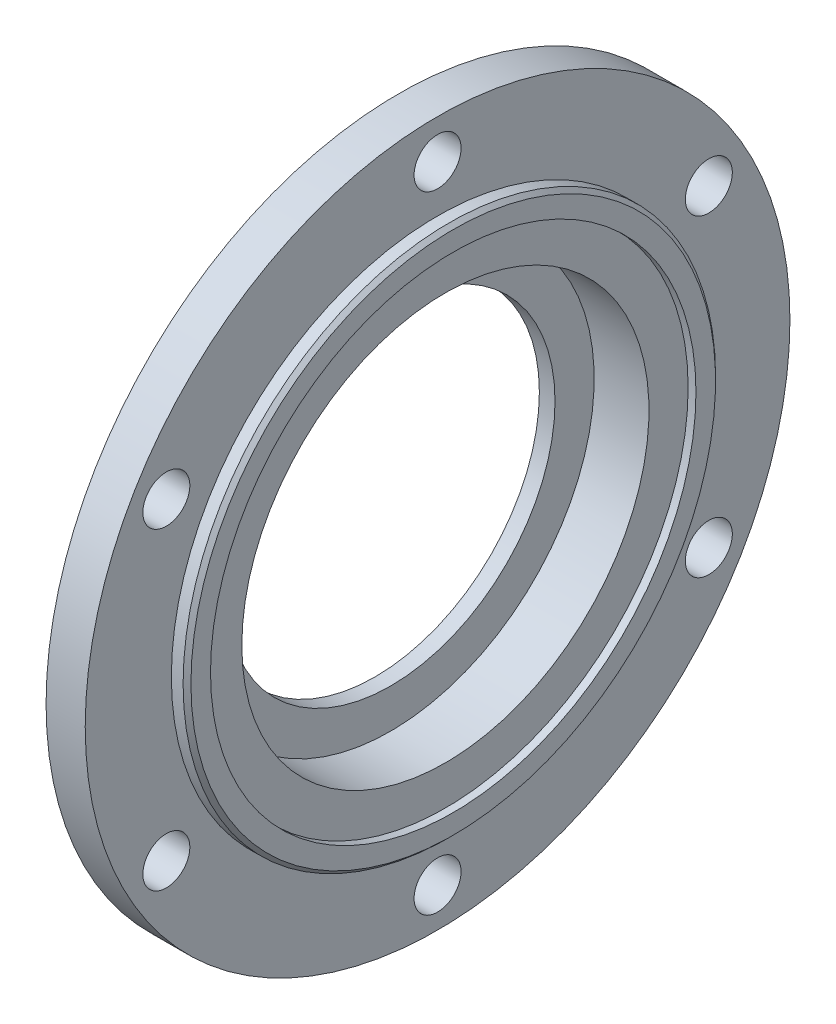
ISO-10303-21;
HEADER;
FILE_DESCRIPTION(('STEP AP214'),'2;1');
FILE_NAME('part.step','',(''),(''),'','','');
FILE_SCHEMA(('AUTOMOTIVE_DESIGN { 1 0 10303 214 1 1 1 1 }'));
ENDSEC;
DATA;
#1=APPLICATION_CONTEXT('core data for automotive mechanical design processes');
#2=APPLICATION_PROTOCOL_DEFINITION('international standard','automotive_design',2000,#1);
#3=PRODUCT_CONTEXT('',#1,'mechanical');
#4=PRODUCT('Part','Part','',(#3));
#5=PRODUCT_RELATED_PRODUCT_CATEGORY('part','',(#4));
#6=PRODUCT_DEFINITION_FORMATION('','',#4);
#7=PRODUCT_DEFINITION_CONTEXT('part definition',#1,'design');
#8=PRODUCT_DEFINITION('design','',#6,#7);
#9=PRODUCT_DEFINITION_SHAPE('','',#8);
#10=(LENGTH_UNIT() NAMED_UNIT(*) SI_UNIT(.MILLI.,.METRE.));
#11=(NAMED_UNIT(*) PLANE_ANGLE_UNIT() SI_UNIT($,.RADIAN.));
#12=(NAMED_UNIT(*) SI_UNIT($,.STERADIAN.) SOLID_ANGLE_UNIT());
#13=UNCERTAINTY_MEASURE_WITH_UNIT(LENGTH_MEASURE(1.E-05),#10,'distance_accuracy_value','');
#14=(GEOMETRIC_REPRESENTATION_CONTEXT(3) GLOBAL_UNCERTAINTY_ASSIGNED_CONTEXT((#13)) GLOBAL_UNIT_ASSIGNED_CONTEXT((#10,
#11,#12)) REPRESENTATION_CONTEXT('',''));
#15=CARTESIAN_POINT('',(0.,0.,0.));
#16=DIRECTION('',(0.,0.,1.));
#17=DIRECTION('',(1.,0.,0.));
#18=AXIS2_PLACEMENT_3D('',#15,#16,#17);
#19=CARTESIAN_POINT('',(0.,0.,0.));
#20=DIRECTION('',(-1.,0.,0.));
#21=DIRECTION('',(0.,0.,1.));
#22=AXIS2_PLACEMENT_3D('',#19,#20,#21);
#23=CYLINDRICAL_SURFACE('',#22,21.);
#24=CARTESIAN_POINT('',(2.,0.,0.));
#25=DIRECTION('',(-1.,0.,0.));
#26=DIRECTION('',(0.,0.,1.));
#27=AXIS2_PLACEMENT_3D('',#24,#25,#26);
#28=CIRCLE('',#27,21.);
#29=CARTESIAN_POINT('',(2.,0.,21.));
#30=VERTEX_POINT('',#29);
#31=EDGE_CURVE('E78',#30,#30,#28,.T.);
#32=ORIENTED_EDGE('',*,*,#31,.F.);
#33=EDGE_LOOP('',(#32));
#34=FACE_BOUND('',#33,.T.);
#35=CARTESIAN_POINT('',(0.,0.,0.));
#36=DIRECTION('',(-1.,0.,0.));
#37=DIRECTION('',(0.,0.,1.));
#38=AXIS2_PLACEMENT_3D('',#35,#36,#37);
#39=CIRCLE('',#38,21.);
#40=CARTESIAN_POINT('',(0.,0.,21.));
#41=VERTEX_POINT('',#40);
#42=EDGE_CURVE('E10',#41,#41,#39,.T.);
#43=ORIENTED_EDGE('',*,*,#42,.T.);
#44=EDGE_LOOP('',(#43));
#45=FACE_BOUND('',#44,.T.);
#46=ADVANCED_FACE('F37',(#34,#45),#23,.F.);
#47=CARTESIAN_POINT('',(0.,0.,-21.));
#48=DIRECTION('',(1.,0.,0.));
#49=DIRECTION('',(0.,0.,-1.));
#50=AXIS2_PLACEMENT_3D('',#47,#48,#49);
#51=PLANE('',#50);
#52=ORIENTED_EDGE('',*,*,#42,.F.);
#53=EDGE_LOOP('',(#52));
#54=FACE_BOUND('',#53,.T.);
#55=CARTESIAN_POINT('',(0.,0.,0.));
#56=DIRECTION('',(-1.,0.,0.));
#57=DIRECTION('',(0.,0.,1.));
#58=AXIS2_PLACEMENT_3D('',#55,#56,#57);
#59=CIRCLE('',#58,31.);
#60=CARTESIAN_POINT('',(0.,0.,31.));
#61=VERTEX_POINT('',#60);
#62=EDGE_CURVE('E45',#61,#61,#59,.T.);
#63=ORIENTED_EDGE('',*,*,#62,.T.);
#64=EDGE_LOOP('',(#63));
#65=FACE_BOUND('',#64,.T.);
#66=ADVANCED_FACE('F198',(#54,#65),#51,.F.);
#67=CARTESIAN_POINT('',(3.,0.,0.));
#68=DIRECTION('',(1.,0.,0.));
#69=DIRECTION('',(0.,0.,-1.));
#70=AXIS2_PLACEMENT_3D('',#67,#68,#69);
#71=CONICAL_SURFACE('',#70,34.,0.785398163397447);
#72=ORIENTED_EDGE('',*,*,#62,.F.);
#73=EDGE_LOOP('',(#72));
#74=FACE_BOUND('',#73,.T.);
#75=CARTESIAN_POINT('',(3.,0.,0.));
#76=DIRECTION('',(-1.,0.,0.));
#77=DIRECTION('',(0.,0.,1.));
#78=AXIS2_PLACEMENT_3D('',#75,#76,#77);
#79=CIRCLE('',#78,34.);
#80=CARTESIAN_POINT('',(3.,0.,34.));
#81=VERTEX_POINT('',#80);
#82=EDGE_CURVE('E51',#81,#81,#79,.T.);
#83=ORIENTED_EDGE('',*,*,#82,.T.);
#84=EDGE_LOOP('',(#83));
#85=FACE_BOUND('',#84,.T.);
#86=ADVANCED_FACE('F129',(#74,#85),#71,.T.);
#87=CARTESIAN_POINT('',(3.,0.,-34.));
#88=DIRECTION('',(1.,0.,0.));
#89=DIRECTION('',(0.,0.,-1.));
#90=AXIS2_PLACEMENT_3D('',#87,#88,#89);
#91=PLANE('',#90);
#92=CARTESIAN_POINT('',(3.,40.,0.));
#93=DIRECTION('',(-1.,0.,0.));
#94=DIRECTION('',(0.,0.,1.));
#95=AXIS2_PLACEMENT_3D('',#92,#93,#94);
#96=CIRCLE('',#95,3.);
#97=CARTESIAN_POINT('',(3.,40.,3.));
#98=VERTEX_POINT('',#97);
#99=EDGE_CURVE('E60',#98,#98,#96,.T.);
#100=ORIENTED_EDGE('',*,*,#99,.F.);
#101=EDGE_LOOP('',(#100));
#102=FACE_BOUND('',#101,.T.);
#103=CARTESIAN_POINT('',(3.,19.999999999998,-34.6410161513764));
#104=DIRECTION('',(-1.,0.,0.));
#105=DIRECTION('',(0.,0.,1.));
#106=AXIS2_PLACEMENT_3D('',#103,#104,#105);
#107=CIRCLE('',#106,3.00000000000214);
#108=CARTESIAN_POINT('',(3.,19.999999999998,-31.6410161513743));
#109=VERTEX_POINT('',#108);
#110=EDGE_CURVE('E322',#109,#109,#107,.T.);
#111=ORIENTED_EDGE('',*,*,#110,.F.);
#112=EDGE_LOOP('',(#111));
#113=FACE_BOUND('',#112,.T.);
#114=CARTESIAN_POINT('',(3.,-20.000000000002,-34.6410161513741));
#115=DIRECTION('',(-1.,0.,0.));
#116=DIRECTION('',(0.,0.,1.));
#117=AXIS2_PLACEMENT_3D('',#114,#115,#116);
#118=CIRCLE('',#117,3.00000000000418);
#119=CARTESIAN_POINT('',(3.,-20.000000000002,-31.64101615137));
#120=VERTEX_POINT('',#119);
#121=EDGE_CURVE('E92',#120,#120,#118,.T.);
#122=ORIENTED_EDGE('',*,*,#121,.F.);
#123=EDGE_LOOP('',(#122));
#124=FACE_BOUND('',#123,.T.);
#125=CARTESIAN_POINT('',(3.,-40.,4.53277774727487E-12));
#126=DIRECTION('',(-1.,0.,0.));
#127=DIRECTION('',(0.,0.,1.));
#128=AXIS2_PLACEMENT_3D('',#125,#126,#127);
#129=CIRCLE('',#128,3.0000000000046);
#130=CARTESIAN_POINT('',(3.,-40.,3.00000000000914));
#131=VERTEX_POINT('',#130);
#132=EDGE_CURVE('E328',#131,#131,#129,.T.);
#133=ORIENTED_EDGE('',*,*,#132,.F.);
#134=EDGE_LOOP('',(#133));
#135=FACE_BOUND('',#134,.T.);
#136=CARTESIAN_POINT('',(3.,-19.999999999998,34.6410161513809));
#137=DIRECTION('',(-1.,0.,0.));
#138=DIRECTION('',(0.,0.,1.));
#139=AXIS2_PLACEMENT_3D('',#136,#137,#138);
#140=CIRCLE('',#139,3.00000000000286);
#141=CARTESIAN_POINT('',(3.,-19.999999999998,37.6410161513838));
#142=VERTEX_POINT('',#141);
#143=EDGE_CURVE('E319',#142,#142,#140,.T.);
#144=ORIENTED_EDGE('',*,*,#143,.F.);
#145=EDGE_LOOP('',(#144));
#146=FACE_BOUND('',#145,.T.);
#147=CARTESIAN_POINT('',(3.,20.000000000002,34.6410161513787));
#148=DIRECTION('',(-1.,0.,0.));
#149=DIRECTION('',(0.,0.,1.));
#150=AXIS2_PLACEMENT_3D('',#147,#148,#149);
#151=CIRCLE('',#150,3.00000000000062);
#152=CARTESIAN_POINT('',(3.,20.000000000002,37.6410161513793));
#153=VERTEX_POINT('',#152);
#154=EDGE_CURVE('E315',#153,#153,#151,.T.);
#155=ORIENTED_EDGE('',*,*,#154,.F.);
#156=EDGE_LOOP('',(#155));
#157=FACE_BOUND('',#156,.T.);
#158=ORIENTED_EDGE('',*,*,#82,.F.);
#159=EDGE_LOOP('',(#158));
#160=FACE_BOUND('',#159,.T.);
#161=CARTESIAN_POINT('',(3.,0.,0.));
#162=DIRECTION('',(-1.,0.,0.));
#163=DIRECTION('',(0.,0.,1.));
#164=AXIS2_PLACEMENT_3D('',#161,#162,#163);
#165=CIRCLE('',#164,45.);
#166=CARTESIAN_POINT('',(3.,0.,45.));
#167=VERTEX_POINT('',#166);
#168=EDGE_CURVE('E122',#167,#167,#165,.T.);
#169=ORIENTED_EDGE('',*,*,#168,.T.);
#170=EDGE_LOOP('',(#169));
#171=FACE_BOUND('',#170,.T.);
#172=ADVANCED_FACE('F131',(#102,#113,#124,#135,#146,#157,#160,#171),#91,.F.);
#173=CARTESIAN_POINT('',(0.,0.,0.));
#174=DIRECTION('',(-1.,0.,0.));
#175=DIRECTION('',(0.,0.,1.));
#176=AXIS2_PLACEMENT_3D('',#173,#174,#175);
#177=CYLINDRICAL_SURFACE('',#176,45.);
#178=ORIENTED_EDGE('',*,*,#168,.F.);
#179=EDGE_LOOP('',(#178));
#180=FACE_BOUND('',#179,.T.);
#181=CARTESIAN_POINT('',(8.,0.,0.));
#182=DIRECTION('',(-1.,0.,0.));
#183=DIRECTION('',(0.,0.,1.));
#184=AXIS2_PLACEMENT_3D('',#181,#182,#183);
#185=CIRCLE('',#184,45.);
#186=CARTESIAN_POINT('',(8.,0.,45.));
#187=VERTEX_POINT('',#186);
#188=EDGE_CURVE('E118',#187,#187,#185,.T.);
#189=ORIENTED_EDGE('',*,*,#188,.T.);
#190=EDGE_LOOP('',(#189));
#191=FACE_BOUND('',#190,.T.);
#192=ADVANCED_FACE('F134',(#180,#191),#177,.T.);
#193=CARTESIAN_POINT('',(8.,0.,-45.));
#194=DIRECTION('',(-1.,0.,0.));
#195=DIRECTION('',(0.,0.,1.));
#196=AXIS2_PLACEMENT_3D('',#193,#194,#195);
#197=PLANE('',#196);
#198=CARTESIAN_POINT('',(8.,40.,0.));
#199=DIRECTION('',(-1.,0.,0.));
#200=DIRECTION('',(0.,0.,1.));
#201=AXIS2_PLACEMENT_3D('',#198,#199,#200);
#202=CIRCLE('',#201,3.);
#203=CARTESIAN_POINT('',(8.,40.,3.));
#204=VERTEX_POINT('',#203);
#205=EDGE_CURVE('E40',#204,#204,#202,.T.);
#206=ORIENTED_EDGE('',*,*,#205,.T.);
#207=EDGE_LOOP('',(#206));
#208=FACE_BOUND('',#207,.T.);
#209=CARTESIAN_POINT('',(8.,19.999999999998,-34.6410161513764));
#210=DIRECTION('',(-1.,0.,0.));
#211=DIRECTION('',(0.,0.,1.));
#212=AXIS2_PLACEMENT_3D('',#209,#210,#211);
#213=CIRCLE('',#212,3.00000000000214);
#214=CARTESIAN_POINT('',(8.,19.999999999998,-31.6410161513743));
#215=VERTEX_POINT('',#214);
#216=EDGE_CURVE('E71',#215,#215,#213,.T.);
#217=ORIENTED_EDGE('',*,*,#216,.T.);
#218=EDGE_LOOP('',(#217));
#219=FACE_BOUND('',#218,.T.);
#220=CARTESIAN_POINT('',(8.,-20.000000000002,-34.6410161513741));
#221=DIRECTION('',(-1.,0.,0.));
#222=DIRECTION('',(0.,0.,1.));
#223=AXIS2_PLACEMENT_3D('',#220,#221,#222);
#224=CIRCLE('',#223,3.00000000000418);
#225=CARTESIAN_POINT('',(8.,-20.000000000002,-31.64101615137));
#226=VERTEX_POINT('',#225);
#227=EDGE_CURVE('E68',#226,#226,#224,.T.);
#228=ORIENTED_EDGE('',*,*,#227,.T.);
#229=EDGE_LOOP('',(#228));
#230=FACE_BOUND('',#229,.T.);
#231=CARTESIAN_POINT('',(8.,-40.,4.53277774727487E-12));
#232=DIRECTION('',(-1.,0.,0.));
#233=DIRECTION('',(0.,0.,1.));
#234=AXIS2_PLACEMENT_3D('',#231,#232,#233);
#235=CIRCLE('',#234,3.0000000000046);
#236=CARTESIAN_POINT('',(8.,-40.,3.00000000000914));
#237=VERTEX_POINT('',#236);
#238=EDGE_CURVE('E64',#237,#237,#235,.T.);
#239=ORIENTED_EDGE('',*,*,#238,.T.);
#240=EDGE_LOOP('',(#239));
#241=FACE_BOUND('',#240,.T.);
#242=CARTESIAN_POINT('',(8.,-19.999999999998,34.6410161513809));
#243=DIRECTION('',(-1.,0.,0.));
#244=DIRECTION('',(0.,0.,1.));
#245=AXIS2_PLACEMENT_3D('',#242,#243,#244);
#246=CIRCLE('',#245,3.00000000000286);
#247=CARTESIAN_POINT('',(8.,-19.999999999998,37.6410161513838));
#248=VERTEX_POINT('',#247);
#249=EDGE_CURVE('E59',#248,#248,#246,.T.);
#250=ORIENTED_EDGE('',*,*,#249,.T.);
#251=EDGE_LOOP('',(#250));
#252=FACE_BOUND('',#251,.T.);
#253=CARTESIAN_POINT('',(8.,20.000000000002,34.6410161513787));
#254=DIRECTION('',(-1.,0.,0.));
#255=DIRECTION('',(0.,0.,1.));
#256=AXIS2_PLACEMENT_3D('',#253,#254,#255);
#257=CIRCLE('',#256,3.00000000000062);
#258=CARTESIAN_POINT('',(8.,20.000000000002,37.6410161513793));
#259=VERTEX_POINT('',#258);
#260=EDGE_CURVE('E55',#259,#259,#257,.T.);
#261=ORIENTED_EDGE('',*,*,#260,.T.);
#262=EDGE_LOOP('',(#261));
#263=FACE_BOUND('',#262,.T.);
#264=ORIENTED_EDGE('',*,*,#188,.F.);
#265=EDGE_LOOP('',(#264));
#266=FACE_BOUND('',#265,.T.);
#267=CARTESIAN_POINT('',(8.,0.,0.));
#268=DIRECTION('',(-1.,0.,0.));
#269=DIRECTION('',(0.,0.,1.));
#270=AXIS2_PLACEMENT_3D('',#267,#268,#269);
#271=CIRCLE('',#270,34.);
#272=CARTESIAN_POINT('',(8.,0.,34.));
#273=VERTEX_POINT('',#272);
#274=EDGE_CURVE('E114',#273,#273,#271,.T.);
#275=ORIENTED_EDGE('',*,*,#274,.T.);
#276=EDGE_LOOP('',(#275));
#277=FACE_BOUND('',#276,.T.);
#278=ADVANCED_FACE('F141',(#208,#219,#230,#241,#252,#263,#266,#277),#197,.F.);
#279=CARTESIAN_POINT('',(0.,0.,0.));
#280=DIRECTION('',(-1.,0.,0.));
#281=DIRECTION('',(0.,0.,1.));
#282=AXIS2_PLACEMENT_3D('',#279,#280,#281);
#283=CYLINDRICAL_SURFACE('',#282,34.);
#284=ORIENTED_EDGE('',*,*,#274,.F.);
#285=EDGE_LOOP('',(#284));
#286=FACE_BOUND('',#285,.T.);
#287=CARTESIAN_POINT('',(9.5,0.,0.));
#288=DIRECTION('',(-1.,0.,0.));
#289=DIRECTION('',(0.,0.,1.));
#290=AXIS2_PLACEMENT_3D('',#287,#288,#289);
#291=CIRCLE('',#290,34.);
#292=CARTESIAN_POINT('',(9.5,0.,34.));
#293=VERTEX_POINT('',#292);
#294=EDGE_CURVE('E110',#293,#293,#291,.T.);
#295=ORIENTED_EDGE('',*,*,#294,.T.);
#296=EDGE_LOOP('',(#295));
#297=FACE_BOUND('',#296,.T.);
#298=ADVANCED_FACE('F147',(#286,#297),#283,.T.);
#299=CARTESIAN_POINT('',(10.,0.,0.));
#300=DIRECTION('',(-1.,0.,0.));
#301=DIRECTION('',(0.,0.,1.));
#302=AXIS2_PLACEMENT_3D('',#299,#300,#301);
#303=CONICAL_SURFACE('',#302,33.5,0.78539816339745);
#304=ORIENTED_EDGE('',*,*,#294,.F.);
#305=EDGE_LOOP('',(#304));
#306=FACE_BOUND('',#305,.T.);
#307=CARTESIAN_POINT('',(10.,0.,0.));
#308=DIRECTION('',(-1.,0.,0.));
#309=DIRECTION('',(0.,0.,1.));
#310=AXIS2_PLACEMENT_3D('',#307,#308,#309);
#311=CIRCLE('',#310,33.5);
#312=CARTESIAN_POINT('',(10.,0.,33.5));
#313=VERTEX_POINT('',#312);
#314=EDGE_CURVE('E106',#313,#313,#311,.T.);
#315=ORIENTED_EDGE('',*,*,#314,.T.);
#316=EDGE_LOOP('',(#315));
#317=FACE_BOUND('',#316,.T.);
#318=ADVANCED_FACE('F153',(#306,#317),#303,.T.);
#319=CARTESIAN_POINT('',(10.,0.,-33.5));
#320=DIRECTION('',(-1.,0.,0.));
#321=DIRECTION('',(0.,0.,1.));
#322=AXIS2_PLACEMENT_3D('',#319,#320,#321);
#323=PLANE('',#322);
#324=ORIENTED_EDGE('',*,*,#314,.F.);
#325=EDGE_LOOP('',(#324));
#326=FACE_BOUND('',#325,.T.);
#327=CARTESIAN_POINT('',(10.,0.,0.));
#328=DIRECTION('',(-1.,0.,0.));
#329=DIRECTION('',(0.,0.,1.));
#330=AXIS2_PLACEMENT_3D('',#327,#328,#329);
#331=CIRCLE('',#330,31.);
#332=CARTESIAN_POINT('',(10.,0.,31.));
#333=VERTEX_POINT('',#332);
#334=EDGE_CURVE('E102',#333,#333,#331,.T.);
#335=ORIENTED_EDGE('',*,*,#334,.T.);
#336=EDGE_LOOP('',(#335));
#337=FACE_BOUND('',#336,.T.);
#338=ADVANCED_FACE('F159',(#326,#337),#323,.F.);
#339=CARTESIAN_POINT('',(0.,0.,0.));
#340=DIRECTION('',(-1.,0.,0.));
#341=DIRECTION('',(0.,0.,1.));
#342=AXIS2_PLACEMENT_3D('',#339,#340,#341);
#343=CYLINDRICAL_SURFACE('',#342,31.);
#344=ORIENTED_EDGE('',*,*,#334,.F.);
#345=EDGE_LOOP('',(#344));
#346=FACE_BOUND('',#345,.T.);
#347=CARTESIAN_POINT('',(9.,0.,0.));
#348=DIRECTION('',(-1.,0.,0.));
#349=DIRECTION('',(0.,0.,1.));
#350=AXIS2_PLACEMENT_3D('',#347,#348,#349);
#351=CIRCLE('',#350,31.);
#352=CARTESIAN_POINT('',(9.,0.,31.));
#353=VERTEX_POINT('',#352);
#354=EDGE_CURVE('E98',#353,#353,#351,.T.);
#355=ORIENTED_EDGE('',*,*,#354,.T.);
#356=EDGE_LOOP('',(#355));
#357=FACE_BOUND('',#356,.T.);
#358=ADVANCED_FACE('F165',(#346,#357),#343,.F.);
#359=CARTESIAN_POINT('',(9.,0.,-31.));
#360=DIRECTION('',(-1.,0.,0.));
#361=DIRECTION('',(0.,0.,1.));
#362=AXIS2_PLACEMENT_3D('',#359,#360,#361);
#363=PLANE('',#362);
#364=ORIENTED_EDGE('',*,*,#354,.F.);
#365=EDGE_LOOP('',(#364));
#366=FACE_BOUND('',#365,.T.);
#367=CARTESIAN_POINT('',(9.,0.,0.));
#368=DIRECTION('',(-1.,0.,0.));
#369=DIRECTION('',(0.,0.,1.));
#370=AXIS2_PLACEMENT_3D('',#367,#368,#369);
#371=CIRCLE('',#370,26.);
#372=CARTESIAN_POINT('',(9.,0.,26.));
#373=VERTEX_POINT('',#372);
#374=EDGE_CURVE('E89',#373,#373,#371,.T.);
#375=ORIENTED_EDGE('',*,*,#374,.T.);
#376=EDGE_LOOP('',(#375));
#377=FACE_BOUND('',#376,.T.);
#378=ADVANCED_FACE('F171',(#366,#377),#363,.F.);
#379=CARTESIAN_POINT('',(0.,0.,0.));
#380=DIRECTION('',(-1.,0.,0.));
#381=DIRECTION('',(0.,0.,1.));
#382=AXIS2_PLACEMENT_3D('',#379,#380,#381);
#383=CYLINDRICAL_SURFACE('',#382,26.);
#384=ORIENTED_EDGE('',*,*,#374,.F.);
#385=EDGE_LOOP('',(#384));
#386=FACE_BOUND('',#385,.T.);
#387=CARTESIAN_POINT('',(2.,0.,0.));
#388=DIRECTION('',(-1.,0.,0.));
#389=DIRECTION('',(0.,0.,1.));
#390=AXIS2_PLACEMENT_3D('',#387,#388,#389);
#391=CIRCLE('',#390,26.);
#392=CARTESIAN_POINT('',(2.,0.,26.));
#393=VERTEX_POINT('',#392);
#394=EDGE_CURVE('E83',#393,#393,#391,.T.);
#395=ORIENTED_EDGE('',*,*,#394,.T.);
#396=EDGE_LOOP('',(#395));
#397=FACE_BOUND('',#396,.T.);
#398=ADVANCED_FACE('F177',(#386,#397),#383,.F.);
#399=CARTESIAN_POINT('',(2.,0.,-26.));
#400=DIRECTION('',(-1.,0.,0.));
#401=DIRECTION('',(0.,0.,1.));
#402=AXIS2_PLACEMENT_3D('',#399,#400,#401);
#403=PLANE('',#402);
#404=ORIENTED_EDGE('',*,*,#394,.F.);
#405=EDGE_LOOP('',(#404));
#406=FACE_BOUND('',#405,.T.);
#407=ORIENTED_EDGE('',*,*,#31,.T.);
#408=EDGE_LOOP('',(#407));
#409=FACE_BOUND('',#408,.T.);
#410=ADVANCED_FACE('F183',(#406,#409),#403,.F.);
#411=CARTESIAN_POINT('',(13.,20.000000000002,34.6410161513787));
#412=DIRECTION('',(-1.,0.,0.));
#413=DIRECTION('',(0.,0.,1.));
#414=AXIS2_PLACEMENT_3D('',#411,#412,#413);
#415=CYLINDRICAL_SURFACE('',#414,3.00000000000062);
#416=ORIENTED_EDGE('',*,*,#154,.T.);
#417=EDGE_LOOP('',(#416));
#418=FACE_BOUND('',#417,.T.);
#419=ORIENTED_EDGE('',*,*,#260,.F.);
#420=EDGE_LOOP('',(#419));
#421=FACE_BOUND('',#420,.T.);
#422=ADVANCED_FACE('F188',(#418,#421),#415,.F.);
#423=CARTESIAN_POINT('',(13.,-19.999999999998,34.6410161513809));
#424=DIRECTION('',(-1.,0.,0.));
#425=DIRECTION('',(0.,0.,1.));
#426=AXIS2_PLACEMENT_3D('',#423,#424,#425);
#427=CYLINDRICAL_SURFACE('',#426,3.00000000000286);
#428=ORIENTED_EDGE('',*,*,#143,.T.);
#429=EDGE_LOOP('',(#428));
#430=FACE_BOUND('',#429,.T.);
#431=ORIENTED_EDGE('',*,*,#249,.F.);
#432=EDGE_LOOP('',(#431));
#433=FACE_BOUND('',#432,.T.);
#434=ADVANCED_FACE('F193',(#430,#433),#427,.F.);
#435=CARTESIAN_POINT('',(13.,-40.,4.53277774727487E-12));
#436=DIRECTION('',(-1.,0.,0.));
#437=DIRECTION('',(0.,0.,1.));
#438=AXIS2_PLACEMENT_3D('',#435,#436,#437);
#439=CYLINDRICAL_SURFACE('',#438,3.0000000000046);
#440=ORIENTED_EDGE('',*,*,#132,.T.);
#441=EDGE_LOOP('',(#440));
#442=FACE_BOUND('',#441,.T.);
#443=ORIENTED_EDGE('',*,*,#238,.F.);
#444=EDGE_LOOP('',(#443));
#445=FACE_BOUND('',#444,.T.);
#446=ADVANCED_FACE('F268',(#442,#445),#439,.F.);
#447=CARTESIAN_POINT('',(13.,-20.000000000002,-34.6410161513741));
#448=DIRECTION('',(-1.,0.,0.));
#449=DIRECTION('',(0.,0.,1.));
#450=AXIS2_PLACEMENT_3D('',#447,#448,#449);
#451=CYLINDRICAL_SURFACE('',#450,3.00000000000418);
#452=ORIENTED_EDGE('',*,*,#121,.T.);
#453=EDGE_LOOP('',(#452));
#454=FACE_BOUND('',#453,.T.);
#455=ORIENTED_EDGE('',*,*,#227,.F.);
#456=EDGE_LOOP('',(#455));
#457=FACE_BOUND('',#456,.T.);
#458=ADVANCED_FACE('F277',(#454,#457),#451,.F.);
#459=CARTESIAN_POINT('',(13.,19.999999999998,-34.6410161513764));
#460=DIRECTION('',(-1.,0.,0.));
#461=DIRECTION('',(0.,0.,1.));
#462=AXIS2_PLACEMENT_3D('',#459,#460,#461);
#463=CYLINDRICAL_SURFACE('',#462,3.00000000000214);
#464=ORIENTED_EDGE('',*,*,#110,.T.);
#465=EDGE_LOOP('',(#464));
#466=FACE_BOUND('',#465,.T.);
#467=ORIENTED_EDGE('',*,*,#216,.F.);
#468=EDGE_LOOP('',(#467));
#469=FACE_BOUND('',#468,.T.);
#470=ADVANCED_FACE('F286',(#466,#469),#463,.F.);
#471=CARTESIAN_POINT('',(13.,40.,0.));
#472=DIRECTION('',(-1.,0.,0.));
#473=DIRECTION('',(0.,0.,1.));
#474=AXIS2_PLACEMENT_3D('',#471,#472,#473);
#475=CYLINDRICAL_SURFACE('',#474,3.);
#476=ORIENTED_EDGE('',*,*,#99,.T.);
#477=EDGE_LOOP('',(#476));
#478=FACE_BOUND('',#477,.T.);
#479=ORIENTED_EDGE('',*,*,#205,.F.);
#480=EDGE_LOOP('',(#479));
#481=FACE_BOUND('',#480,.T.);
#482=ADVANCED_FACE('F294',(#478,#481),#475,.F.);
#483=CLOSED_SHELL('',(#46,#66,#86,#172,#192,#278,#298,#318,#338,#358,#378,#398,#410,#422,#434,
#446,#458,#470,#482));
#484=MANIFOLD_SOLID_BREP('B2',#483);
#485=ADVANCED_BREP_SHAPE_REPRESENTATION('',(#18,#484),#14);
#486=SHAPE_DEFINITION_REPRESENTATION(#9,#485);
ENDSEC;
END-ISO-10303-21;
